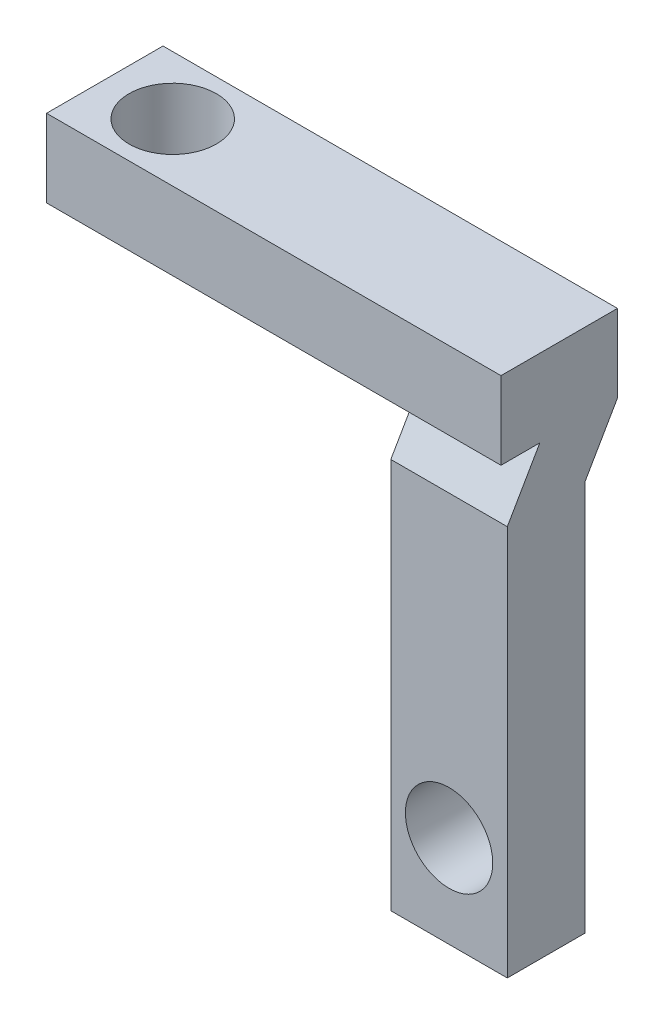
ISO-10303-21;
HEADER;
FILE_DESCRIPTION(('STEP AP214'),'2;1');
FILE_NAME('part.step','',(''),(''),'','','');
FILE_SCHEMA(('AUTOMOTIVE_DESIGN { 1 0 10303 214 1 1 1 1 }'));
ENDSEC;
DATA;
#1=APPLICATION_CONTEXT('core data for automotive mechanical design processes');
#2=APPLICATION_PROTOCOL_DEFINITION('international standard','automotive_design',2000,#1);
#3=PRODUCT_CONTEXT('',#1,'mechanical');
#4=PRODUCT('Part','Part','',(#3));
#5=PRODUCT_RELATED_PRODUCT_CATEGORY('part','',(#4));
#6=PRODUCT_DEFINITION_FORMATION('','',#4);
#7=PRODUCT_DEFINITION_CONTEXT('part definition',#1,'design');
#8=PRODUCT_DEFINITION('design','',#6,#7);
#9=PRODUCT_DEFINITION_SHAPE('','',#8);
#10=(LENGTH_UNIT() NAMED_UNIT(*) SI_UNIT(.MILLI.,.METRE.));
#11=(NAMED_UNIT(*) PLANE_ANGLE_UNIT() SI_UNIT($,.RADIAN.));
#12=(NAMED_UNIT(*) SI_UNIT($,.STERADIAN.) SOLID_ANGLE_UNIT());
#13=UNCERTAINTY_MEASURE_WITH_UNIT(LENGTH_MEASURE(1.E-05),#10,'distance_accuracy_value','');
#14=(GEOMETRIC_REPRESENTATION_CONTEXT(3) GLOBAL_UNCERTAINTY_ASSIGNED_CONTEXT((#13)) GLOBAL_UNIT_ASSIGNED_CONTEXT((#10,
#11,#12)) REPRESENTATION_CONTEXT('',''));
#15=CARTESIAN_POINT('',(0.,0.,0.));
#16=DIRECTION('',(0.,0.,1.));
#17=DIRECTION('',(1.,0.,0.));
#18=AXIS2_PLACEMENT_3D('',#15,#16,#17);
#19=CARTESIAN_POINT('',(-12.,-211.541766085023,-366.401086782107));
#20=DIRECTION('',(0.,0.500000000000003,0.866025403784437));
#21=DIRECTION('',(0.,-0.866025403784437,0.500000000000003));
#22=AXIS2_PLACEMENT_3D('',#19,#20,#21);
#23=PLANE('',#22);
#24=DIRECTION('',(0.,-0.866025403784437,0.500000000000003));
#25=VECTOR('',#24,1.);
#26=CARTESIAN_POINT('',(0.,-211.541766085023,-366.401086782107));
#27=LINE('',#26,#25);
#28=CARTESIAN_POINT('',(0.,-8.,-483.915980222628));
#29=VERTEX_POINT('',#28);
#30=CARTESIAN_POINT('',(0.,-13.8023702053557,-480.565980222628));
#31=VERTEX_POINT('',#30);
#32=EDGE_CURVE('E117',#29,#31,#27,.T.);
#33=ORIENTED_EDGE('',*,*,#32,.T.);
#34=DIRECTION('',(1.,0.,0.));
#35=VECTOR('',#34,1.);
#36=CARTESIAN_POINT('',(-12.,-13.8023702053557,-480.565980222628));
#37=LINE('',#36,#35);
#38=CARTESIAN_POINT('',(-12.,-13.8023702053557,-480.565980222628));
#39=VERTEX_POINT('',#38);
#40=EDGE_CURVE('E11',#39,#31,#37,.T.);
#41=ORIENTED_EDGE('',*,*,#40,.F.);
#42=DIRECTION('',(0.,-0.866025403784437,0.500000000000003));
#43=VECTOR('',#42,1.);
#44=CARTESIAN_POINT('',(-12.,-211.541766085023,-366.401086782107));
#45=LINE('',#44,#43);
#46=CARTESIAN_POINT('',(-12.,-8.,-483.915980222628));
#47=VERTEX_POINT('',#46);
#48=EDGE_CURVE('E53',#47,#39,#45,.T.);
#49=ORIENTED_EDGE('',*,*,#48,.F.);
#50=DIRECTION('',(1.,0.,0.));
#51=VECTOR('',#50,1.);
#52=CARTESIAN_POINT('',(-12.,-8.,-483.915980222628));
#53=LINE('',#52,#51);
#54=EDGE_CURVE('E38',#47,#29,#53,.T.);
#55=ORIENTED_EDGE('',*,*,#54,.T.);
#56=EDGE_LOOP('',(#33,#41,#49,#55));
#57=FACE_BOUND('',#56,.T.);
#58=ADVANCED_FACE('F35',(#57),#23,.F.);
#59=CARTESIAN_POINT('',(-12.,0.,-480.565980222628));
#60=DIRECTION('',(0.,0.,-1.));
#61=DIRECTION('',(-1.,0.,0.));
#62=AXIS2_PLACEMENT_3D('',#59,#60,#61);
#63=PLANE('',#62);
#64=CARTESIAN_POINT('',(-6.,-44.5699999953557,-480.565980222628));
#65=DIRECTION('',(0.,0.,-1.));
#66=DIRECTION('',(-1.,0.,0.));
#67=AXIS2_PLACEMENT_3D('',#64,#65,#66);
#68=CIRCLE('',#67,4.5);
#69=CARTESIAN_POINT('',(-10.5,-44.5699999953557,-480.565980222628));
#70=VERTEX_POINT('',#69);
#71=EDGE_CURVE('E193',#70,#70,#68,.F.);
#72=ORIENTED_EDGE('',*,*,#71,.T.);
#73=EDGE_LOOP('',(#72));
#74=FACE_BOUND('',#73,.T.);
#75=DIRECTION('',(0.,1.,0.));
#76=VECTOR('',#75,1.);
#77=CARTESIAN_POINT('',(0.,0.,-480.565980222628));
#78=LINE('',#77,#76);
#79=CARTESIAN_POINT('',(0.,-54.0699999953557,-480.565980222628));
#80=VERTEX_POINT('',#79);
#81=EDGE_CURVE('E126',#80,#31,#78,.T.);
#82=ORIENTED_EDGE('',*,*,#81,.F.);
#83=DIRECTION('',(1.,0.,0.));
#84=VECTOR('',#83,1.);
#85=CARTESIAN_POINT('',(-12.,-54.0699999953557,-480.565980222628));
#86=LINE('',#85,#84);
#87=CARTESIAN_POINT('',(-12.,-54.0699999953557,-480.565980222628));
#88=VERTEX_POINT('',#87);
#89=EDGE_CURVE('E44',#88,#80,#86,.T.);
#90=ORIENTED_EDGE('',*,*,#89,.F.);
#91=DIRECTION('',(0.,1.,0.));
#92=VECTOR('',#91,1.);
#93=CARTESIAN_POINT('',(-12.,0.,-480.565980222628));
#94=LINE('',#93,#92);
#95=EDGE_CURVE('E98',#88,#39,#94,.T.);
#96=ORIENTED_EDGE('',*,*,#95,.T.);
#97=ORIENTED_EDGE('',*,*,#40,.T.);
#98=EDGE_LOOP('',(#82,#90,#96,#97));
#99=FACE_BOUND('',#98,.T.);
#100=ADVANCED_FACE('F211',(#74,#99),#63,.T.);
#101=CARTESIAN_POINT('',(-12.,-54.0699999953557,0.));
#102=DIRECTION('',(0.,1.,0.));
#103=DIRECTION('',(0.,0.,1.));
#104=AXIS2_PLACEMENT_3D('',#101,#102,#103);
#105=PLANE('',#104);
#106=DIRECTION('',(0.,0.,1.));
#107=VECTOR('',#106,1.);
#108=CARTESIAN_POINT('',(0.,-54.0699999953557,0.));
#109=LINE('',#108,#107);
#110=CARTESIAN_POINT('',(0.,-54.0699999953557,-472.565980222628));
#111=VERTEX_POINT('',#110);
#112=EDGE_CURVE('E103',#80,#111,#109,.T.);
#113=ORIENTED_EDGE('',*,*,#112,.T.);
#114=DIRECTION('',(1.,0.,0.));
#115=VECTOR('',#114,1.);
#116=CARTESIAN_POINT('',(-12.,-54.0699999953557,-472.565980222628));
#117=LINE('',#116,#115);
#118=CARTESIAN_POINT('',(-12.,-54.0699999953557,-472.565980222628));
#119=VERTEX_POINT('',#118);
#120=EDGE_CURVE('E101',#119,#111,#117,.T.);
#121=ORIENTED_EDGE('',*,*,#120,.F.);
#122=DIRECTION('',(0.,0.,1.));
#123=VECTOR('',#122,1.);
#124=CARTESIAN_POINT('',(-12.,-54.0699999953557,0.));
#125=LINE('',#124,#123);
#126=EDGE_CURVE('E92',#88,#119,#125,.T.);
#127=ORIENTED_EDGE('',*,*,#126,.F.);
#128=ORIENTED_EDGE('',*,*,#89,.T.);
#129=EDGE_LOOP('',(#113,#121,#127,#128));
#130=FACE_BOUND('',#129,.T.);
#131=ADVANCED_FACE('F102',(#130),#105,.F.);
#132=CARTESIAN_POINT('',(-12.,0.,-472.565980222628));
#133=DIRECTION('',(0.,0.,-1.));
#134=DIRECTION('',(-1.,0.,0.));
#135=AXIS2_PLACEMENT_3D('',#132,#133,#134);
#136=PLANE('',#135);
#137=CARTESIAN_POINT('',(-6.,-44.5699999953557,-472.565980222628));
#138=DIRECTION('',(0.,0.,1.));
#139=DIRECTION('',(1.,0.,0.));
#140=AXIS2_PLACEMENT_3D('',#137,#138,#139);
#141=CIRCLE('',#140,4.5);
#142=CARTESIAN_POINT('',(-1.5,-44.5699999953557,-472.565980222628));
#143=VERTEX_POINT('',#142);
#144=EDGE_CURVE('E196',#143,#143,#141,.T.);
#145=ORIENTED_EDGE('',*,*,#144,.F.);
#146=EDGE_LOOP('',(#145));
#147=FACE_BOUND('',#146,.T.);
#148=DIRECTION('',(0.,1.,0.));
#149=VECTOR('',#148,1.);
#150=CARTESIAN_POINT('',(0.,0.,-472.565980222628));
#151=LINE('',#150,#149);
#152=CARTESIAN_POINT('',(0.,-13.8023702053557,-472.565980222628));
#153=VERTEX_POINT('',#152);
#154=EDGE_CURVE('E123',#111,#153,#151,.T.);
#155=ORIENTED_EDGE('',*,*,#154,.T.);
#156=DIRECTION('',(1.,0.,0.));
#157=VECTOR('',#156,1.);
#158=CARTESIAN_POINT('',(-12.,-13.8023702053557,-472.565980222628));
#159=LINE('',#158,#157);
#160=CARTESIAN_POINT('',(-12.,-13.8023702053557,-472.565980222628));
#161=VERTEX_POINT('',#160);
#162=EDGE_CURVE('E107',#161,#153,#159,.T.);
#163=ORIENTED_EDGE('',*,*,#162,.F.);
#164=DIRECTION('',(0.,1.,0.));
#165=VECTOR('',#164,1.);
#166=CARTESIAN_POINT('',(-12.,0.,-472.565980222628));
#167=LINE('',#166,#165);
#168=EDGE_CURVE('E96',#119,#161,#167,.T.);
#169=ORIENTED_EDGE('',*,*,#168,.F.);
#170=ORIENTED_EDGE('',*,*,#120,.T.);
#171=EDGE_LOOP('',(#155,#163,#169,#170));
#172=FACE_BOUND('',#171,.T.);
#173=ADVANCED_FACE('F109',(#147,#172),#136,.F.);
#174=CARTESIAN_POINT('',(-12.,-208.077664469885,-360.401086782107));
#175=DIRECTION('',(0.,0.500000000000004,0.866025403784436));
#176=DIRECTION('',(0.,-0.866025403784436,0.500000000000004));
#177=AXIS2_PLACEMENT_3D('',#174,#175,#176);
#178=PLANE('',#177);
#179=DIRECTION('',(0.,-0.866025403784436,0.500000000000004));
#180=VECTOR('',#179,1.);
#181=CARTESIAN_POINT('',(0.,-208.077664469885,-360.401086782107));
#182=LINE('',#181,#180);
#183=CARTESIAN_POINT('',(0.,-8.,-475.915980222628));
#184=VERTEX_POINT('',#183);
#185=EDGE_CURVE('E119',#184,#153,#182,.T.);
#186=ORIENTED_EDGE('',*,*,#185,.F.);
#187=DIRECTION('',(1.,0.,0.));
#188=VECTOR('',#187,1.);
#189=CARTESIAN_POINT('',(-12.,-8.,-475.915980222628));
#190=LINE('',#189,#188);
#191=CARTESIAN_POINT('',(-12.,-8.,-475.915980222628));
#192=VERTEX_POINT('',#191);
#193=EDGE_CURVE('E130',#192,#184,#190,.T.);
#194=ORIENTED_EDGE('',*,*,#193,.F.);
#195=DIRECTION('',(0.,-0.866025403784436,0.500000000000004));
#196=VECTOR('',#195,1.);
#197=CARTESIAN_POINT('',(-12.,-208.077664469885,-360.401086782107));
#198=LINE('',#197,#196);
#199=EDGE_CURVE('E111',#192,#161,#198,.T.);
#200=ORIENTED_EDGE('',*,*,#199,.T.);
#201=ORIENTED_EDGE('',*,*,#162,.T.);
#202=EDGE_LOOP('',(#186,#194,#200,#201));
#203=FACE_BOUND('',#202,.T.);
#204=ADVANCED_FACE('F204',(#203),#178,.T.);
#205=CARTESIAN_POINT('',(-12.,0.,0.));
#206=DIRECTION('',(1.,0.,0.));
#207=DIRECTION('',(0.,0.,-1.));
#208=AXIS2_PLACEMENT_3D('',#205,#206,#207);
#209=PLANE('',#208);
#210=ORIENTED_EDGE('',*,*,#48,.T.);
#211=ORIENTED_EDGE('',*,*,#95,.F.);
#212=ORIENTED_EDGE('',*,*,#126,.T.);
#213=ORIENTED_EDGE('',*,*,#168,.T.);
#214=ORIENTED_EDGE('',*,*,#199,.F.);
#215=DIRECTION('',(0.,0.,-1.));
#216=VECTOR('',#215,1.);
#217=CARTESIAN_POINT('',(-12.,-8.0000000000001,0.));
#218=LINE('',#217,#216);
#219=EDGE_CURVE('E83',#192,#47,#218,.T.);
#220=ORIENTED_EDGE('',*,*,#219,.T.);
#221=EDGE_LOOP('',(#210,#211,#212,#213,#214,#220));
#222=FACE_BOUND('',#221,.T.);
#223=ADVANCED_FACE('F94',(#222),#209,.F.);
#224=CARTESIAN_POINT('',(0.,0.,0.));
#225=DIRECTION('',(1.,0.,0.));
#226=DIRECTION('',(0.,0.,-1.));
#227=AXIS2_PLACEMENT_3D('',#224,#225,#226);
#228=PLANE('',#227);
#229=ORIENTED_EDGE('',*,*,#32,.F.);
#230=DIRECTION('',(0.,1.,0.));
#231=VECTOR('',#230,1.);
#232=CARTESIAN_POINT('',(0.,0.,-483.915980222628));
#233=LINE('',#232,#231);
#234=CARTESIAN_POINT('',(0.,0.,-483.915980222628));
#235=VERTEX_POINT('',#234);
#236=EDGE_CURVE('E147',#29,#235,#233,.T.);
#237=ORIENTED_EDGE('',*,*,#236,.T.);
#238=DIRECTION('',(0.,0.,-1.));
#239=VECTOR('',#238,1.);
#240=CARTESIAN_POINT('',(0.,0.,0.));
#241=LINE('',#240,#239);
#242=CARTESIAN_POINT('',(0.,0.,-471.915980222628));
#243=VERTEX_POINT('',#242);
#244=EDGE_CURVE('E154',#243,#235,#241,.T.);
#245=ORIENTED_EDGE('',*,*,#244,.F.);
#246=DIRECTION('',(0.,-1.,0.));
#247=VECTOR('',#246,1.);
#248=CARTESIAN_POINT('',(0.,0.,-471.915980222628));
#249=LINE('',#248,#247);
#250=CARTESIAN_POINT('',(0.,-8.,-471.915980222628));
#251=VERTEX_POINT('',#250);
#252=EDGE_CURVE('E157',#243,#251,#249,.T.);
#253=ORIENTED_EDGE('',*,*,#252,.T.);
#254=DIRECTION('',(0.,0.,-1.));
#255=VECTOR('',#254,1.);
#256=CARTESIAN_POINT('',(0.,-8.,0.));
#257=LINE('',#256,#255);
#258=EDGE_CURVE('E155',#251,#184,#257,.T.);
#259=ORIENTED_EDGE('',*,*,#258,.T.);
#260=ORIENTED_EDGE('',*,*,#185,.T.);
#261=ORIENTED_EDGE('',*,*,#154,.F.);
#262=ORIENTED_EDGE('',*,*,#112,.F.);
#263=ORIENTED_EDGE('',*,*,#81,.T.);
#264=EDGE_LOOP('',(#229,#237,#245,#253,#259,#260,#261,#262,#263));
#265=FACE_BOUND('',#264,.T.);
#266=ADVANCED_FACE('F144',(#265),#228,.T.);
#267=CARTESIAN_POINT('',(-46.82,-8.,0.));
#268=DIRECTION('',(0.,-1.,0.));
#269=DIRECTION('',(0.,0.,-1.));
#270=AXIS2_PLACEMENT_3D('',#267,#268,#269);
#271=PLANE('',#270);
#272=CARTESIAN_POINT('',(-39.82,-8.,-477.915980222628));
#273=DIRECTION('',(0.,-1.,0.));
#274=DIRECTION('',(0.,0.,-1.));
#275=AXIS2_PLACEMENT_3D('',#272,#273,#274);
#276=CIRCLE('',#275,4.5);
#277=CARTESIAN_POINT('',(-39.82,-8.,-482.415980222628));
#278=VERTEX_POINT('',#277);
#279=EDGE_CURVE('E190',#278,#278,#276,.T.);
#280=ORIENTED_EDGE('',*,*,#279,.F.);
#281=EDGE_LOOP('',(#280));
#282=FACE_BOUND('',#281,.T.);
#283=ORIENTED_EDGE('',*,*,#219,.F.);
#284=ORIENTED_EDGE('',*,*,#193,.T.);
#285=ORIENTED_EDGE('',*,*,#258,.F.);
#286=DIRECTION('',(1.,0.,0.));
#287=VECTOR('',#286,1.);
#288=CARTESIAN_POINT('',(-46.82,-8.,-471.915980222628));
#289=LINE('',#288,#287);
#290=CARTESIAN_POINT('',(-46.82,-8.,-471.915980222628));
#291=VERTEX_POINT('',#290);
#292=EDGE_CURVE('E120',#291,#251,#289,.T.);
#293=ORIENTED_EDGE('',*,*,#292,.F.);
#294=DIRECTION('',(0.,0.,-1.));
#295=VECTOR('',#294,1.);
#296=CARTESIAN_POINT('',(-46.82,-8.,0.));
#297=LINE('',#296,#295);
#298=CARTESIAN_POINT('',(-46.82,-8.,-483.915980222628));
#299=VERTEX_POINT('',#298);
#300=EDGE_CURVE('E165',#291,#299,#297,.T.);
#301=ORIENTED_EDGE('',*,*,#300,.T.);
#302=DIRECTION('',(1.,0.,0.));
#303=VECTOR('',#302,1.);
#304=CARTESIAN_POINT('',(-46.82,-8.,-483.915980222628));
#305=LINE('',#304,#303);
#306=EDGE_CURVE('E172',#299,#47,#305,.T.);
#307=ORIENTED_EDGE('',*,*,#306,.T.);
#308=EDGE_LOOP('',(#283,#284,#285,#293,#301,#307));
#309=FACE_BOUND('',#308,.T.);
#310=ADVANCED_FACE('F224',(#282,#309),#271,.T.);
#311=CARTESIAN_POINT('',(-46.82,0.,-471.915980222628));
#312=DIRECTION('',(0.,0.,1.));
#313=DIRECTION('',(1.,0.,0.));
#314=AXIS2_PLACEMENT_3D('',#311,#312,#313);
#315=PLANE('',#314);
#316=ORIENTED_EDGE('',*,*,#252,.F.);
#317=DIRECTION('',(1.,0.,0.));
#318=VECTOR('',#317,1.);
#319=CARTESIAN_POINT('',(-46.82,0.,-471.915980222628));
#320=LINE('',#319,#318);
#321=CARTESIAN_POINT('',(-46.82,0.,-471.915980222628));
#322=VERTEX_POINT('',#321);
#323=EDGE_CURVE('E168',#322,#243,#320,.T.);
#324=ORIENTED_EDGE('',*,*,#323,.F.);
#325=DIRECTION('',(0.,-1.,0.));
#326=VECTOR('',#325,1.);
#327=CARTESIAN_POINT('',(-46.82,0.,-471.915980222628));
#328=LINE('',#327,#326);
#329=EDGE_CURVE('E174',#322,#291,#328,.T.);
#330=ORIENTED_EDGE('',*,*,#329,.T.);
#331=ORIENTED_EDGE('',*,*,#292,.T.);
#332=EDGE_LOOP('',(#316,#324,#330,#331));
#333=FACE_BOUND('',#332,.T.);
#334=ADVANCED_FACE('F229',(#333),#315,.T.);
#335=CARTESIAN_POINT('',(-46.82,0.,0.));
#336=DIRECTION('',(0.,-1.,0.));
#337=DIRECTION('',(0.,0.,-1.));
#338=AXIS2_PLACEMENT_3D('',#335,#336,#337);
#339=PLANE('',#338);
#340=CARTESIAN_POINT('',(-39.82,0.,-477.915980222628));
#341=DIRECTION('',(0.,-1.,0.));
#342=DIRECTION('',(0.,0.,-1.));
#343=AXIS2_PLACEMENT_3D('',#340,#341,#342);
#344=CIRCLE('',#343,4.5);
#345=CARTESIAN_POINT('',(-39.82,0.,-482.415980222628));
#346=VERTEX_POINT('',#345);
#347=EDGE_CURVE('E159',#346,#346,#344,.F.);
#348=ORIENTED_EDGE('',*,*,#347,.F.);
#349=EDGE_LOOP('',(#348));
#350=FACE_BOUND('',#349,.T.);
#351=ORIENTED_EDGE('',*,*,#244,.T.);
#352=DIRECTION('',(1.,0.,0.));
#353=VECTOR('',#352,1.);
#354=CARTESIAN_POINT('',(-46.82,0.,-483.915980222628));
#355=LINE('',#354,#353);
#356=CARTESIAN_POINT('',(-46.82,0.,-483.915980222628));
#357=VERTEX_POINT('',#356);
#358=EDGE_CURVE('E152',#357,#235,#355,.T.);
#359=ORIENTED_EDGE('',*,*,#358,.F.);
#360=DIRECTION('',(0.,0.,-1.));
#361=VECTOR('',#360,1.);
#362=CARTESIAN_POINT('',(-46.82,0.,0.));
#363=LINE('',#362,#361);
#364=EDGE_CURVE('E177',#322,#357,#363,.T.);
#365=ORIENTED_EDGE('',*,*,#364,.F.);
#366=ORIENTED_EDGE('',*,*,#323,.T.);
#367=EDGE_LOOP('',(#351,#359,#365,#366));
#368=FACE_BOUND('',#367,.T.);
#369=ADVANCED_FACE('F234',(#350,#368),#339,.F.);
#370=CARTESIAN_POINT('',(-46.82,0.,-483.915980222628));
#371=DIRECTION('',(0.,0.,-1.));
#372=DIRECTION('',(-1.,0.,0.));
#373=AXIS2_PLACEMENT_3D('',#370,#371,#372);
#374=PLANE('',#373);
#375=ORIENTED_EDGE('',*,*,#236,.F.);
#376=ORIENTED_EDGE('',*,*,#54,.F.);
#377=ORIENTED_EDGE('',*,*,#306,.F.);
#378=DIRECTION('',(0.,1.,0.));
#379=VECTOR('',#378,1.);
#380=CARTESIAN_POINT('',(-46.82,0.,-483.915980222628));
#381=LINE('',#380,#379);
#382=EDGE_CURVE('E183',#299,#357,#381,.T.);
#383=ORIENTED_EDGE('',*,*,#382,.T.);
#384=ORIENTED_EDGE('',*,*,#358,.T.);
#385=EDGE_LOOP('',(#375,#376,#377,#383,#384));
#386=FACE_BOUND('',#385,.T.);
#387=ADVANCED_FACE('F149',(#386),#374,.T.);
#388=CARTESIAN_POINT('',(-46.82,0.,0.));
#389=DIRECTION('',(1.,0.,0.));
#390=DIRECTION('',(0.,0.,-1.));
#391=AXIS2_PLACEMENT_3D('',#388,#389,#390);
#392=PLANE('',#391);
#393=ORIENTED_EDGE('',*,*,#300,.F.);
#394=ORIENTED_EDGE('',*,*,#329,.F.);
#395=ORIENTED_EDGE('',*,*,#364,.T.);
#396=ORIENTED_EDGE('',*,*,#382,.F.);
#397=EDGE_LOOP('',(#393,#394,#395,#396));
#398=FACE_BOUND('',#397,.T.);
#399=ADVANCED_FACE('F233',(#398),#392,.F.);
#400=CARTESIAN_POINT('',(-39.82,0.000999999999999265,-477.915980222628));
#401=DIRECTION('',(0.,-1.,0.));
#402=DIRECTION('',(0.,0.,-1.));
#403=AXIS2_PLACEMENT_3D('',#400,#401,#402);
#404=CYLINDRICAL_SURFACE('',#403,4.5);
#405=ORIENTED_EDGE('',*,*,#279,.T.);
#406=EDGE_LOOP('',(#405));
#407=FACE_BOUND('',#406,.T.);
#408=ORIENTED_EDGE('',*,*,#347,.T.);
#409=EDGE_LOOP('',(#408));
#410=FACE_BOUND('',#409,.T.);
#411=ADVANCED_FACE('F242',(#407,#410),#404,.F.);
#412=CARTESIAN_POINT('',(-6.,-44.5699999953557,-493.293902283986));
#413=DIRECTION('',(0.,0.,1.));
#414=DIRECTION('',(1.,0.,0.));
#415=AXIS2_PLACEMENT_3D('',#412,#413,#414);
#416=CYLINDRICAL_SURFACE('',#415,4.5);
#417=ORIENTED_EDGE('',*,*,#144,.T.);
#418=EDGE_LOOP('',(#417));
#419=FACE_BOUND('',#418,.T.);
#420=ORIENTED_EDGE('',*,*,#71,.F.);
#421=EDGE_LOOP('',(#420));
#422=FACE_BOUND('',#421,.T.);
#423=ADVANCED_FACE('F200',(#419,#422),#416,.F.);
#424=CLOSED_SHELL('',(#58,#100,#131,#173,#204,#223,#266,#310,#334,#369,#387,#399,#411,#423));
#425=MANIFOLD_SOLID_BREP('B2',#424);
#426=ADVANCED_BREP_SHAPE_REPRESENTATION('',(#18,#425),#14);
#427=SHAPE_DEFINITION_REPRESENTATION(#9,#426);
ENDSEC;
END-ISO-10303-21;
